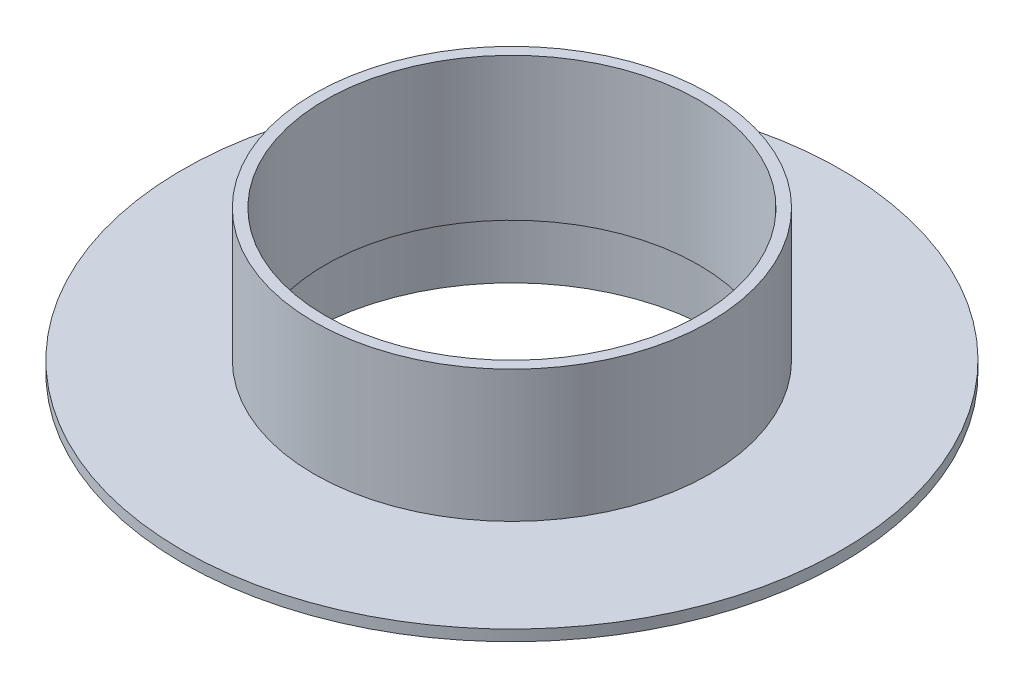
ISO-10303-21;
HEADER;
FILE_DESCRIPTION(('STEP AP214'),'2;1');
FILE_NAME('part.step','',(''),(''),'','','');
FILE_SCHEMA(('AUTOMOTIVE_DESIGN { 1 0 10303 214 1 1 1 1 }'));
ENDSEC;
DATA;
#1=APPLICATION_CONTEXT('core data for automotive mechanical design processes');
#2=APPLICATION_PROTOCOL_DEFINITION('international standard','automotive_design',2000,#1);
#3=PRODUCT_CONTEXT('',#1,'mechanical');
#4=PRODUCT('Part','Part','',(#3));
#5=PRODUCT_RELATED_PRODUCT_CATEGORY('part','',(#4));
#6=PRODUCT_DEFINITION_FORMATION('','',#4);
#7=PRODUCT_DEFINITION_CONTEXT('part definition',#1,'design');
#8=PRODUCT_DEFINITION('design','',#6,#7);
#9=PRODUCT_DEFINITION_SHAPE('','',#8);
#10=(LENGTH_UNIT() NAMED_UNIT(*) SI_UNIT(.MILLI.,.METRE.));
#11=(NAMED_UNIT(*) PLANE_ANGLE_UNIT() SI_UNIT($,.RADIAN.));
#12=(NAMED_UNIT(*) SI_UNIT($,.STERADIAN.) SOLID_ANGLE_UNIT());
#13=UNCERTAINTY_MEASURE_WITH_UNIT(LENGTH_MEASURE(1.E-05),#10,'distance_accuracy_value','');
#14=(GEOMETRIC_REPRESENTATION_CONTEXT(3) GLOBAL_UNCERTAINTY_ASSIGNED_CONTEXT((#13)) GLOBAL_UNIT_ASSIGNED_CONTEXT((#10,
#11,#12)) REPRESENTATION_CONTEXT('',''));
#15=CARTESIAN_POINT('',(0.,0.,0.));
#16=DIRECTION('',(0.,0.,1.));
#17=DIRECTION('',(1.,0.,0.));
#18=AXIS2_PLACEMENT_3D('',#15,#16,#17);
#19=CARTESIAN_POINT('',(0.,0.,0.));
#20=DIRECTION('',(0.,1.,0.));
#21=DIRECTION('',(0.,0.,1.));
#22=AXIS2_PLACEMENT_3D('',#19,#20,#21);
#23=PLANE('',#22);
#24=CARTESIAN_POINT('',(0.,0.,0.));
#25=DIRECTION('',(0.,-1.,0.));
#26=DIRECTION('',(0.,0.,-1.));
#27=AXIS2_PLACEMENT_3D('',#24,#25,#26);
#28=CIRCLE('',#27,85.);
#29=CARTESIAN_POINT('',(0.,0.,-85.));
#30=VERTEX_POINT('',#29);
#31=EDGE_CURVE('E79',#30,#30,#28,.T.);
#32=ORIENTED_EDGE('',*,*,#31,.F.);
#33=EDGE_LOOP('',(#32));
#34=FACE_BOUND('',#33,.T.);
#35=CARTESIAN_POINT('',(0.,0.,0.));
#36=DIRECTION('',(0.,-1.,0.));
#37=DIRECTION('',(0.,0.,-1.));
#38=AXIS2_PLACEMENT_3D('',#35,#36,#37);
#39=CIRCLE('',#38,92.5);
#40=CARTESIAN_POINT('',(0.,0.,-92.5));
#41=VERTEX_POINT('',#40);
#42=EDGE_CURVE('E87',#41,#41,#39,.T.);
#43=ORIENTED_EDGE('',*,*,#42,.T.);
#44=EDGE_LOOP('',(#43));
#45=FACE_BOUND('',#44,.T.);
#46=ADVANCED_FACE('F44',(#34,#45),#23,.F.);
#47=CARTESIAN_POINT('',(0.,5.,0.));
#48=DIRECTION('',(0.,-1.,0.));
#49=DIRECTION('',(0.,0.,-1.));
#50=AXIS2_PLACEMENT_3D('',#47,#48,#49);
#51=CYLINDRICAL_SURFACE('',#50,150.);
#52=CARTESIAN_POINT('',(0.,5.,0.));
#53=DIRECTION('',(0.,1.,0.));
#54=DIRECTION('',(0.,0.,1.));
#55=AXIS2_PLACEMENT_3D('',#52,#53,#54);
#56=CIRCLE('',#55,150.);
#57=CARTESIAN_POINT('',(0.,5.,150.));
#58=VERTEX_POINT('',#57);
#59=EDGE_CURVE('E57',#58,#58,#56,.T.);
#60=ORIENTED_EDGE('',*,*,#59,.F.);
#61=EDGE_LOOP('',(#60));
#62=FACE_BOUND('',#61,.T.);
#63=CARTESIAN_POINT('',(0.,0.,0.));
#64=DIRECTION('',(0.,1.,0.));
#65=DIRECTION('',(0.,0.,1.));
#66=AXIS2_PLACEMENT_3D('',#63,#64,#65);
#67=CIRCLE('',#66,150.);
#68=CARTESIAN_POINT('',(0.,0.,150.));
#69=VERTEX_POINT('',#68);
#70=EDGE_CURVE('E63',#69,#69,#67,.T.);
#71=ORIENTED_EDGE('',*,*,#70,.T.);
#72=EDGE_LOOP('',(#71));
#73=FACE_BOUND('',#72,.T.);
#74=ADVANCED_FACE('F46',(#62,#73),#51,.T.);
#75=CARTESIAN_POINT('',(0.,5.,0.));
#76=DIRECTION('',(0.,1.,0.));
#77=DIRECTION('',(0.,0.,1.));
#78=AXIS2_PLACEMENT_3D('',#75,#76,#77);
#79=PLANE('',#78);
#80=CARTESIAN_POINT('',(0.,5.,0.));
#81=DIRECTION('',(0.,1.,0.));
#82=DIRECTION('',(0.,0.,1.));
#83=AXIS2_PLACEMENT_3D('',#80,#81,#82);
#84=CIRCLE('',#83,90.);
#85=CARTESIAN_POINT('',(0.,5.,90.));
#86=VERTEX_POINT('',#85);
#87=EDGE_CURVE('E52',#86,#86,#84,.T.);
#88=ORIENTED_EDGE('',*,*,#87,.F.);
#89=EDGE_LOOP('',(#88));
#90=FACE_BOUND('',#89,.T.);
#91=ORIENTED_EDGE('',*,*,#59,.T.);
#92=EDGE_LOOP('',(#91));
#93=FACE_BOUND('',#92,.T.);
#94=ADVANCED_FACE('F124',(#90,#93),#79,.T.);
#95=CARTESIAN_POINT('',(0.,0.,0.));
#96=DIRECTION('',(0.,1.,0.));
#97=DIRECTION('',(0.,0.,1.));
#98=AXIS2_PLACEMENT_3D('',#95,#96,#97);
#99=CIRCLE('',#98,97.5);
#100=CARTESIAN_POINT('',(0.,0.,97.5));
#101=VERTEX_POINT('',#100);
#102=EDGE_CURVE('E10',#101,#101,#99,.F.);
#103=ORIENTED_EDGE('',*,*,#102,.F.);
#104=EDGE_LOOP('',(#103));
#105=FACE_BOUND('',#104,.T.);
#106=ORIENTED_EDGE('',*,*,#70,.F.);
#107=EDGE_LOOP('',(#106));
#108=FACE_BOUND('',#107,.T.);
#109=ADVANCED_FACE('F118',(#105,#108),#23,.F.);
#110=CARTESIAN_POINT('',(0.,65.,0.));
#111=DIRECTION('',(0.,-1.,0.));
#112=DIRECTION('',(0.,0.,-1.));
#113=AXIS2_PLACEMENT_3D('',#110,#111,#112);
#114=CYLINDRICAL_SURFACE('',#113,90.);
#115=CARTESIAN_POINT('',(0.,65.,0.));
#116=DIRECTION('',(0.,1.,0.));
#117=DIRECTION('',(0.,0.,1.));
#118=AXIS2_PLACEMENT_3D('',#115,#116,#117);
#119=CIRCLE('',#118,90.);
#120=CARTESIAN_POINT('',(0.,65.,90.));
#121=VERTEX_POINT('',#120);
#122=EDGE_CURVE('E66',#121,#121,#119,.T.);
#123=ORIENTED_EDGE('',*,*,#122,.F.);
#124=EDGE_LOOP('',(#123));
#125=FACE_BOUND('',#124,.T.);
#126=ORIENTED_EDGE('',*,*,#87,.T.);
#127=EDGE_LOOP('',(#126));
#128=FACE_BOUND('',#127,.T.);
#129=ADVANCED_FACE('F129',(#125,#128),#114,.T.);
#130=CARTESIAN_POINT('',(0.,65.,0.));
#131=DIRECTION('',(0.,1.,0.));
#132=DIRECTION('',(0.,0.,1.));
#133=AXIS2_PLACEMENT_3D('',#130,#131,#132);
#134=PLANE('',#133);
#135=CARTESIAN_POINT('',(0.,65.,0.));
#136=DIRECTION('',(0.,-1.,0.));
#137=DIRECTION('',(0.,0.,-1.));
#138=AXIS2_PLACEMENT_3D('',#135,#136,#137);
#139=CIRCLE('',#138,85.);
#140=CARTESIAN_POINT('',(0.,65.,-85.));
#141=VERTEX_POINT('',#140);
#142=EDGE_CURVE('E74',#141,#141,#139,.T.);
#143=ORIENTED_EDGE('',*,*,#142,.T.);
#144=EDGE_LOOP('',(#143));
#145=FACE_BOUND('',#144,.T.);
#146=ORIENTED_EDGE('',*,*,#122,.T.);
#147=EDGE_LOOP('',(#146));
#148=FACE_BOUND('',#147,.T.);
#149=ADVANCED_FACE('F134',(#145,#148),#134,.T.);
#150=CARTESIAN_POINT('',(0.,65.,0.));
#151=DIRECTION('',(0.,-1.,0.));
#152=DIRECTION('',(0.,0.,-1.));
#153=AXIS2_PLACEMENT_3D('',#150,#151,#152);
#154=CYLINDRICAL_SURFACE('',#153,85.);
#155=ORIENTED_EDGE('',*,*,#142,.F.);
#156=EDGE_LOOP('',(#155));
#157=FACE_BOUND('',#156,.T.);
#158=ORIENTED_EDGE('',*,*,#31,.T.);
#159=EDGE_LOOP('',(#158));
#160=FACE_BOUND('',#159,.T.);
#161=ADVANCED_FACE('F114',(#157,#160),#154,.F.);
#162=CARTESIAN_POINT('',(0.,-30.,0.));
#163=DIRECTION('',(0.,1.,0.));
#164=DIRECTION('',(0.,0.,1.));
#165=AXIS2_PLACEMENT_3D('',#162,#163,#164);
#166=CYLINDRICAL_SURFACE('',#165,92.5);
#167=CARTESIAN_POINT('',(0.,-30.,0.));
#168=DIRECTION('',(0.,-1.,0.));
#169=DIRECTION('',(0.,0.,-1.));
#170=AXIS2_PLACEMENT_3D('',#167,#168,#169);
#171=CIRCLE('',#170,92.5);
#172=CARTESIAN_POINT('',(0.,-30.,-92.5));
#173=VERTEX_POINT('',#172);
#174=EDGE_CURVE('E91',#173,#173,#171,.T.);
#175=ORIENTED_EDGE('',*,*,#174,.T.);
#176=EDGE_LOOP('',(#175));
#177=FACE_BOUND('',#176,.T.);
#178=ORIENTED_EDGE('',*,*,#42,.F.);
#179=EDGE_LOOP('',(#178));
#180=FACE_BOUND('',#179,.T.);
#181=ADVANCED_FACE('F99',(#177,#180),#166,.F.);
#182=CARTESIAN_POINT('',(0.,-30.,0.));
#183=DIRECTION('',(0.,1.,0.));
#184=DIRECTION('',(0.,0.,1.));
#185=AXIS2_PLACEMENT_3D('',#182,#183,#184);
#186=CYLINDRICAL_SURFACE('',#185,97.5);
#187=CARTESIAN_POINT('',(0.,-30.,0.));
#188=DIRECTION('',(0.,-1.,0.));
#189=DIRECTION('',(0.,0.,-1.));
#190=AXIS2_PLACEMENT_3D('',#187,#188,#189);
#191=CIRCLE('',#190,97.5);
#192=CARTESIAN_POINT('',(0.,-30.,-97.5));
#193=VERTEX_POINT('',#192);
#194=EDGE_CURVE('E85',#193,#193,#191,.T.);
#195=ORIENTED_EDGE('',*,*,#194,.F.);
#196=EDGE_LOOP('',(#195));
#197=FACE_BOUND('',#196,.T.);
#198=ORIENTED_EDGE('',*,*,#102,.T.);
#199=EDGE_LOOP('',(#198));
#200=FACE_BOUND('',#199,.T.);
#201=ADVANCED_FACE('F105',(#197,#200),#186,.T.);
#202=CARTESIAN_POINT('',(0.,-30.,0.));
#203=DIRECTION('',(0.,-1.,0.));
#204=DIRECTION('',(0.,0.,-1.));
#205=AXIS2_PLACEMENT_3D('',#202,#203,#204);
#206=PLANE('',#205);
#207=ORIENTED_EDGE('',*,*,#174,.F.);
#208=EDGE_LOOP('',(#207));
#209=FACE_BOUND('',#208,.T.);
#210=ORIENTED_EDGE('',*,*,#194,.T.);
#211=EDGE_LOOP('',(#210));
#212=FACE_BOUND('',#211,.T.);
#213=ADVANCED_FACE('F102',(#209,#212),#206,.T.);
#214=CLOSED_SHELL('',(#46,#74,#94,#109,#129,#149,#161,#181,#201,#213));
#215=MANIFOLD_SOLID_BREP('B2',#214);
#216=ADVANCED_BREP_SHAPE_REPRESENTATION('',(#18,#215),#14);
#217=SHAPE_DEFINITION_REPRESENTATION(#9,#216);
ENDSEC;
END-ISO-10303-21;
